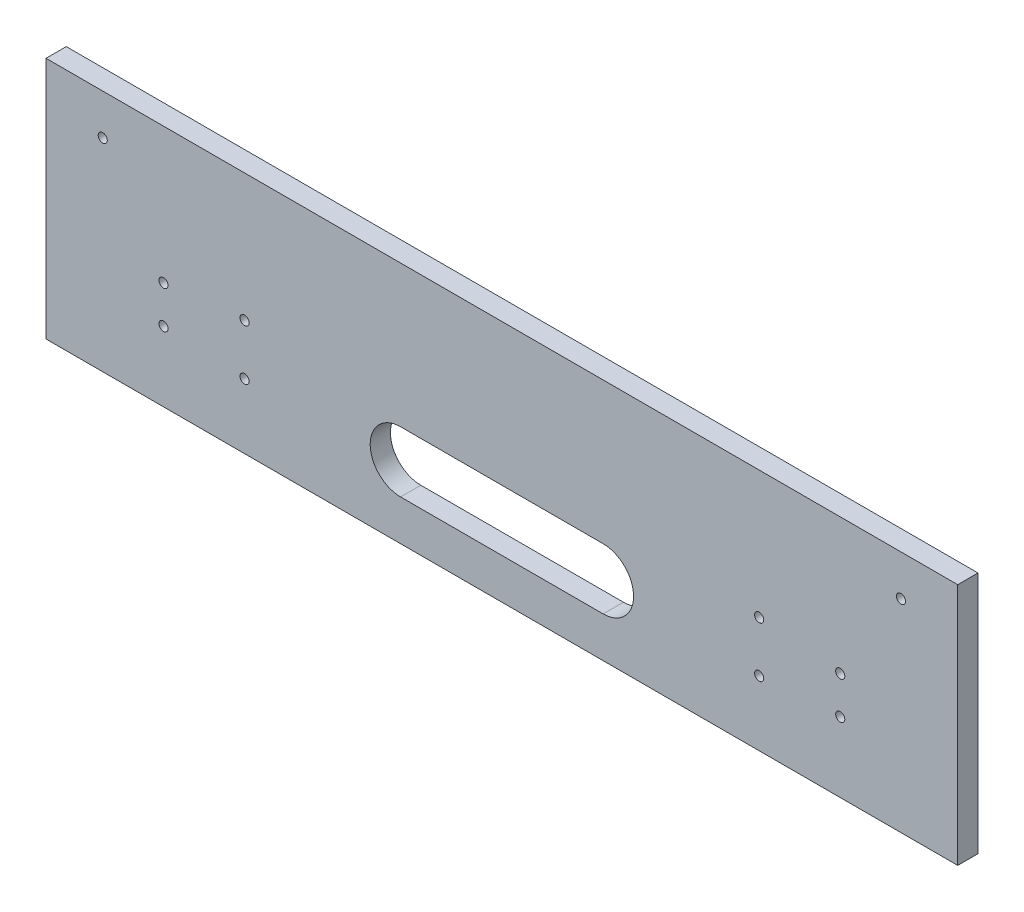
ISO-10303-21;
HEADER;
FILE_DESCRIPTION(('STEP AP214'),'2;1');
FILE_NAME('part.step','',(''),(''),'','','');
FILE_SCHEMA(('AUTOMOTIVE_DESIGN { 1 0 10303 214 1 1 1 1 }'));
ENDSEC;
DATA;
#1=APPLICATION_CONTEXT('core data for automotive mechanical design processes');
#2=APPLICATION_PROTOCOL_DEFINITION('international standard','automotive_design',2000,#1);
#3=PRODUCT_CONTEXT('',#1,'mechanical');
#4=PRODUCT('Part','Part','',(#3));
#5=PRODUCT_RELATED_PRODUCT_CATEGORY('part','',(#4));
#6=PRODUCT_DEFINITION_FORMATION('','',#4);
#7=PRODUCT_DEFINITION_CONTEXT('part definition',#1,'design');
#8=PRODUCT_DEFINITION('design','',#6,#7);
#9=PRODUCT_DEFINITION_SHAPE('','',#8);
#10=(LENGTH_UNIT() NAMED_UNIT(*) SI_UNIT(.MILLI.,.METRE.));
#11=(NAMED_UNIT(*) PLANE_ANGLE_UNIT() SI_UNIT($,.RADIAN.));
#12=(NAMED_UNIT(*) SI_UNIT($,.STERADIAN.) SOLID_ANGLE_UNIT());
#13=UNCERTAINTY_MEASURE_WITH_UNIT(LENGTH_MEASURE(1.E-05),#10,'distance_accuracy_value','');
#14=(GEOMETRIC_REPRESENTATION_CONTEXT(3) GLOBAL_UNCERTAINTY_ASSIGNED_CONTEXT((#13)) GLOBAL_UNIT_ASSIGNED_CONTEXT((#10,
#11,#12)) REPRESENTATION_CONTEXT('',''));
#15=CARTESIAN_POINT('',(0.,0.,0.));
#16=DIRECTION('',(0.,0.,1.));
#17=DIRECTION('',(1.,0.,0.));
#18=AXIS2_PLACEMENT_3D('',#15,#16,#17);
#19=CARTESIAN_POINT('',(-225.,60.,10.));
#20=DIRECTION('',(1.,0.,0.));
#21=DIRECTION('',(0.,0.,-1.));
#22=AXIS2_PLACEMENT_3D('',#19,#20,#21);
#23=PLANE('',#22);
#24=DIRECTION('',(0.,-1.,0.));
#25=VECTOR('',#24,1.);
#26=CARTESIAN_POINT('',(-225.,60.,0.));
#27=LINE('',#26,#25);
#28=CARTESIAN_POINT('',(-225.,60.,0.));
#29=VERTEX_POINT('',#28);
#30=CARTESIAN_POINT('',(-225.,-60.,0.));
#31=VERTEX_POINT('',#30);
#32=EDGE_CURVE('E138',#29,#31,#27,.T.);
#33=ORIENTED_EDGE('',*,*,#32,.T.);
#34=DIRECTION('',(0.,0.,-1.));
#35=VECTOR('',#34,1.);
#36=CARTESIAN_POINT('',(-225.,-60.,10.));
#37=LINE('',#36,#35);
#38=CARTESIAN_POINT('',(-225.,-60.,10.));
#39=VERTEX_POINT('',#38);
#40=EDGE_CURVE('E11',#39,#31,#37,.T.);
#41=ORIENTED_EDGE('',*,*,#40,.F.);
#42=DIRECTION('',(0.,-1.,0.));
#43=VECTOR('',#42,1.);
#44=CARTESIAN_POINT('',(-225.,60.,10.));
#45=LINE('',#44,#43);
#46=CARTESIAN_POINT('',(-225.,60.,10.));
#47=VERTEX_POINT('',#46);
#48=EDGE_CURVE('E142',#47,#39,#45,.T.);
#49=ORIENTED_EDGE('',*,*,#48,.F.);
#50=DIRECTION('',(0.,0.,-1.));
#51=VECTOR('',#50,1.);
#52=CARTESIAN_POINT('',(-225.,60.,10.));
#53=LINE('',#52,#51);
#54=EDGE_CURVE('E152',#47,#29,#53,.T.);
#55=ORIENTED_EDGE('',*,*,#54,.T.);
#56=EDGE_LOOP('',(#33,#41,#49,#55));
#57=FACE_BOUND('',#56,.T.);
#58=ADVANCED_FACE('F37',(#57),#23,.F.);
#59=CARTESIAN_POINT('',(-225.,-60.,10.));
#60=DIRECTION('',(0.,1.,0.));
#61=DIRECTION('',(0.,0.,1.));
#62=AXIS2_PLACEMENT_3D('',#59,#60,#61);
#63=PLANE('',#62);
#64=DIRECTION('',(1.,0.,0.));
#65=VECTOR('',#64,1.);
#66=CARTESIAN_POINT('',(-225.,-60.,0.));
#67=LINE('',#66,#65);
#68=CARTESIAN_POINT('',(225.,-60.,0.));
#69=VERTEX_POINT('',#68);
#70=EDGE_CURVE('E155',#31,#69,#67,.T.);
#71=ORIENTED_EDGE('',*,*,#70,.T.);
#72=DIRECTION('',(0.,0.,-1.));
#73=VECTOR('',#72,1.);
#74=CARTESIAN_POINT('',(225.,-60.,10.));
#75=LINE('',#74,#73);
#76=CARTESIAN_POINT('',(225.,-60.,10.));
#77=VERTEX_POINT('',#76);
#78=EDGE_CURVE('E44',#77,#69,#75,.T.);
#79=ORIENTED_EDGE('',*,*,#78,.F.);
#80=DIRECTION('',(1.,0.,0.));
#81=VECTOR('',#80,1.);
#82=CARTESIAN_POINT('',(-225.,-60.,10.));
#83=LINE('',#82,#81);
#84=EDGE_CURVE('E145',#39,#77,#83,.T.);
#85=ORIENTED_EDGE('',*,*,#84,.F.);
#86=ORIENTED_EDGE('',*,*,#40,.T.);
#87=EDGE_LOOP('',(#71,#79,#85,#86));
#88=FACE_BOUND('',#87,.T.);
#89=ADVANCED_FACE('F183',(#88),#63,.F.);
#90=CARTESIAN_POINT('',(225.,60.,10.));
#91=DIRECTION('',(-1.,0.,0.));
#92=DIRECTION('',(0.,-1.,0.));
#93=AXIS2_PLACEMENT_3D('',#90,#91,#92);
#94=PLANE('',#93);
#95=DIRECTION('',(0.,1.,0.));
#96=VECTOR('',#95,1.);
#97=CARTESIAN_POINT('',(225.,60.,0.));
#98=LINE('',#97,#96);
#99=CARTESIAN_POINT('',(225.,60.,0.));
#100=VERTEX_POINT('',#99);
#101=EDGE_CURVE('E157',#69,#100,#98,.T.);
#102=ORIENTED_EDGE('',*,*,#101,.T.);
#103=DIRECTION('',(0.,0.,-1.));
#104=VECTOR('',#103,1.);
#105=CARTESIAN_POINT('',(225.,60.,10.));
#106=LINE('',#105,#104);
#107=CARTESIAN_POINT('',(225.,60.,10.));
#108=VERTEX_POINT('',#107);
#109=EDGE_CURVE('E162',#108,#100,#106,.T.);
#110=ORIENTED_EDGE('',*,*,#109,.F.);
#111=DIRECTION('',(0.,1.,0.));
#112=VECTOR('',#111,1.);
#113=CARTESIAN_POINT('',(225.,60.,10.));
#114=LINE('',#113,#112);
#115=EDGE_CURVE('E148',#77,#108,#114,.T.);
#116=ORIENTED_EDGE('',*,*,#115,.F.);
#117=ORIENTED_EDGE('',*,*,#78,.T.);
#118=EDGE_LOOP('',(#102,#110,#116,#117));
#119=FACE_BOUND('',#118,.T.);
#120=ADVANCED_FACE('F169',(#119),#94,.F.);
#121=CARTESIAN_POINT('',(-225.,60.,10.));
#122=DIRECTION('',(0.,-1.,0.));
#123=DIRECTION('',(0.,0.,-1.));
#124=AXIS2_PLACEMENT_3D('',#121,#122,#123);
#125=PLANE('',#124);
#126=DIRECTION('',(-1.,0.,0.));
#127=VECTOR('',#126,1.);
#128=CARTESIAN_POINT('',(-225.,60.,0.));
#129=LINE('',#128,#127);
#130=EDGE_CURVE('E146',#100,#29,#129,.T.);
#131=ORIENTED_EDGE('',*,*,#130,.T.);
#132=ORIENTED_EDGE('',*,*,#54,.F.);
#133=DIRECTION('',(-1.,0.,0.));
#134=VECTOR('',#133,1.);
#135=CARTESIAN_POINT('',(-225.,60.,10.));
#136=LINE('',#135,#134);
#137=EDGE_CURVE('E150',#108,#47,#136,.T.);
#138=ORIENTED_EDGE('',*,*,#137,.F.);
#139=ORIENTED_EDGE('',*,*,#109,.T.);
#140=EDGE_LOOP('',(#131,#132,#138,#139));
#141=FACE_BOUND('',#140,.T.);
#142=ADVANCED_FACE('F176',(#141),#125,.F.);
#143=CARTESIAN_POINT('',(0.,0.,10.));
#144=DIRECTION('',(0.,0.,1.));
#145=DIRECTION('',(1.,0.,0.));
#146=AXIS2_PLACEMENT_3D('',#143,#144,#145);
#147=PLANE('',#146);
#148=CARTESIAN_POINT('',(127.,-3.,10.));
#149=DIRECTION('',(0.,0.,1.));
#150=DIRECTION('',(1.,0.,0.));
#151=AXIS2_PLACEMENT_3D('',#148,#149,#150);
#152=CIRCLE('',#151,2.25000000000001);
#153=CARTESIAN_POINT('',(129.25,-3.,10.));
#154=VERTEX_POINT('',#153);
#155=EDGE_CURVE('E272',#154,#154,#152,.T.);
#156=ORIENTED_EDGE('',*,*,#155,.F.);
#157=EDGE_LOOP('',(#156));
#158=FACE_BOUND('',#157,.T.);
#159=CARTESIAN_POINT('',(127.,-28.,10.));
#160=DIRECTION('',(0.,0.,1.));
#161=DIRECTION('',(1.,0.,0.));
#162=AXIS2_PLACEMENT_3D('',#159,#160,#161);
#163=CIRCLE('',#162,2.25000000000001);
#164=CARTESIAN_POINT('',(129.25,-28.,10.));
#165=VERTEX_POINT('',#164);
#166=EDGE_CURVE('E264',#165,#165,#163,.T.);
#167=ORIENTED_EDGE('',*,*,#166,.F.);
#168=EDGE_LOOP('',(#167));
#169=FACE_BOUND('',#168,.T.);
#170=CARTESIAN_POINT('',(-127.,-28.,10.));
#171=DIRECTION('',(0.,0.,1.));
#172=DIRECTION('',(1.,0.,0.));
#173=AXIS2_PLACEMENT_3D('',#170,#171,#172);
#174=CIRCLE('',#173,2.25000000000001);
#175=CARTESIAN_POINT('',(-124.75,-28.,10.));
#176=VERTEX_POINT('',#175);
#177=EDGE_CURVE('E257',#176,#176,#174,.T.);
#178=ORIENTED_EDGE('',*,*,#177,.F.);
#179=EDGE_LOOP('',(#178));
#180=FACE_BOUND('',#179,.T.);
#181=CARTESIAN_POINT('',(-127.,-3.,10.));
#182=DIRECTION('',(0.,0.,1.));
#183=DIRECTION('',(1.,0.,0.));
#184=AXIS2_PLACEMENT_3D('',#181,#182,#183);
#185=CIRCLE('',#184,2.25000000000001);
#186=CARTESIAN_POINT('',(-124.75,-3.,10.));
#187=VERTEX_POINT('',#186);
#188=EDGE_CURVE('E259',#187,#187,#185,.T.);
#189=ORIENTED_EDGE('',*,*,#188,.F.);
#190=EDGE_LOOP('',(#189));
#191=FACE_BOUND('',#190,.T.);
#192=CARTESIAN_POINT('',(197.,40.0000000000019,10.));
#193=DIRECTION('',(0.,0.,-1.));
#194=DIRECTION('',(-1.,0.,0.));
#195=AXIS2_PLACEMENT_3D('',#192,#193,#194);
#196=CIRCLE('',#195,2.25000000000001);
#197=CARTESIAN_POINT('',(194.75,40.0000000000019,10.));
#198=VERTEX_POINT('',#197);
#199=EDGE_CURVE('E279',#198,#198,#196,.T.);
#200=ORIENTED_EDGE('',*,*,#199,.T.);
#201=EDGE_LOOP('',(#200));
#202=FACE_BOUND('',#201,.T.);
#203=CARTESIAN_POINT('',(167.,-25.5000000000003,10.));
#204=DIRECTION('',(0.,0.,-1.));
#205=DIRECTION('',(-1.,0.,0.));
#206=AXIS2_PLACEMENT_3D('',#203,#204,#205);
#207=CIRCLE('',#206,2.25000000000001);
#208=CARTESIAN_POINT('',(164.75,-25.5000000000003,10.));
#209=VERTEX_POINT('',#208);
#210=EDGE_CURVE('E298',#209,#209,#207,.T.);
#211=ORIENTED_EDGE('',*,*,#210,.T.);
#212=EDGE_LOOP('',(#211));
#213=FACE_BOUND('',#212,.T.);
#214=CARTESIAN_POINT('',(-167.,-7.00000000000022,10.));
#215=DIRECTION('',(0.,0.,-1.));
#216=DIRECTION('',(-1.,0.,0.));
#217=AXIS2_PLACEMENT_3D('',#214,#215,#216);
#218=CIRCLE('',#217,2.25000000000001);
#219=CARTESIAN_POINT('',(-169.25,-7.00000000000022,10.));
#220=VERTEX_POINT('',#219);
#221=EDGE_CURVE('E284',#220,#220,#218,.T.);
#222=ORIENTED_EDGE('',*,*,#221,.T.);
#223=EDGE_LOOP('',(#222));
#224=FACE_BOUND('',#223,.T.);
#225=CARTESIAN_POINT('',(-167.,-25.5000000000002,10.));
#226=DIRECTION('',(0.,0.,-1.));
#227=DIRECTION('',(-1.,0.,0.));
#228=AXIS2_PLACEMENT_3D('',#225,#226,#227);
#229=CIRCLE('',#228,2.25000000000001);
#230=CARTESIAN_POINT('',(-169.25,-25.5000000000002,10.));
#231=VERTEX_POINT('',#230);
#232=EDGE_CURVE('E285',#231,#231,#229,.T.);
#233=ORIENTED_EDGE('',*,*,#232,.T.);
#234=EDGE_LOOP('',(#233));
#235=FACE_BOUND('',#234,.T.);
#236=CARTESIAN_POINT('',(-197.,40.0000000000023,10.));
#237=DIRECTION('',(0.,0.,-1.));
#238=DIRECTION('',(-1.,0.,0.));
#239=AXIS2_PLACEMENT_3D('',#236,#237,#238);
#240=CIRCLE('',#239,2.25000000000001);
#241=CARTESIAN_POINT('',(-199.25,40.0000000000023,10.));
#242=VERTEX_POINT('',#241);
#243=EDGE_CURVE('E291',#242,#242,#240,.T.);
#244=ORIENTED_EDGE('',*,*,#243,.T.);
#245=EDGE_LOOP('',(#244));
#246=FACE_BOUND('',#245,.T.);
#247=CARTESIAN_POINT('',(167.,-7.00000000000025,10.));
#248=DIRECTION('',(0.,0.,-1.));
#249=DIRECTION('',(-1.,0.,0.));
#250=AXIS2_PLACEMENT_3D('',#247,#248,#249);
#251=CIRCLE('',#250,2.25000000000001);
#252=CARTESIAN_POINT('',(164.75,-7.00000000000025,10.));
#253=VERTEX_POINT('',#252);
#254=EDGE_CURVE('E132',#253,#253,#251,.T.);
#255=ORIENTED_EDGE('',*,*,#254,.T.);
#256=EDGE_LOOP('',(#255));
#257=FACE_BOUND('',#256,.T.);
#258=CARTESIAN_POINT('',(-50.,-25.,10.));
#259=DIRECTION('',(0.,0.,1.));
#260=DIRECTION('',(1.,0.,0.));
#261=AXIS2_PLACEMENT_3D('',#258,#259,#260);
#262=CIRCLE('',#261,15.);
#263=CARTESIAN_POINT('',(-50.,-10.,10.));
#264=VERTEX_POINT('',#263);
#265=CARTESIAN_POINT('',(-50.,-40.,10.));
#266=VERTEX_POINT('',#265);
#267=EDGE_CURVE('E51',#264,#266,#262,.T.);
#268=ORIENTED_EDGE('',*,*,#267,.F.);
#269=DIRECTION('',(-1.,0.,0.));
#270=VECTOR('',#269,1.);
#271=CARTESIAN_POINT('',(-50.,-10.,10.));
#272=LINE('',#271,#270);
#273=CARTESIAN_POINT('',(50.,-9.99999999999999,10.));
#274=VERTEX_POINT('',#273);
#275=EDGE_CURVE('E119',#274,#264,#272,.T.);
#276=ORIENTED_EDGE('',*,*,#275,.F.);
#277=CARTESIAN_POINT('',(50.,-25.,10.));
#278=DIRECTION('',(0.,0.,1.));
#279=DIRECTION('',(1.,0.,0.));
#280=AXIS2_PLACEMENT_3D('',#277,#278,#279);
#281=CIRCLE('',#280,15.);
#282=CARTESIAN_POINT('',(50.,-40.,10.));
#283=VERTEX_POINT('',#282);
#284=EDGE_CURVE('E122',#283,#274,#281,.T.);
#285=ORIENTED_EDGE('',*,*,#284,.F.);
#286=DIRECTION('',(1.,0.,0.));
#287=VECTOR('',#286,1.);
#288=CARTESIAN_POINT('',(-50.,-40.,10.));
#289=LINE('',#288,#287);
#290=EDGE_CURVE('E131',#266,#283,#289,.T.);
#291=ORIENTED_EDGE('',*,*,#290,.F.);
#292=EDGE_LOOP('',(#268,#276,#285,#291));
#293=FACE_BOUND('',#292,.T.);
#294=ORIENTED_EDGE('',*,*,#48,.T.);
#295=ORIENTED_EDGE('',*,*,#84,.T.);
#296=ORIENTED_EDGE('',*,*,#115,.T.);
#297=ORIENTED_EDGE('',*,*,#137,.T.);
#298=EDGE_LOOP('',(#294,#295,#296,#297));
#299=FACE_BOUND('',#298,.T.);
#300=ADVANCED_FACE('F182',(#158,#169,#180,#191,#202,#213,#224,#235,#246,#257,#293,#299),#147,.T.);
#301=CARTESIAN_POINT('',(0.,0.,0.));
#302=DIRECTION('',(0.,0.,1.));
#303=DIRECTION('',(1.,0.,0.));
#304=AXIS2_PLACEMENT_3D('',#301,#302,#303);
#305=PLANE('',#304);
#306=CARTESIAN_POINT('',(127.,-3.,0.));
#307=DIRECTION('',(0.,0.,1.));
#308=DIRECTION('',(1.,0.,0.));
#309=AXIS2_PLACEMENT_3D('',#306,#307,#308);
#310=CIRCLE('',#309,2.25000000000001);
#311=CARTESIAN_POINT('',(129.25,-3.,0.));
#312=VERTEX_POINT('',#311);
#313=EDGE_CURVE('E275',#312,#312,#310,.T.);
#314=ORIENTED_EDGE('',*,*,#313,.T.);
#315=EDGE_LOOP('',(#314));
#316=FACE_BOUND('',#315,.T.);
#317=CARTESIAN_POINT('',(127.,-28.,0.));
#318=DIRECTION('',(0.,0.,1.));
#319=DIRECTION('',(1.,0.,0.));
#320=AXIS2_PLACEMENT_3D('',#317,#318,#319);
#321=CIRCLE('',#320,2.25000000000001);
#322=CARTESIAN_POINT('',(129.25,-28.,0.));
#323=VERTEX_POINT('',#322);
#324=EDGE_CURVE('E269',#323,#323,#321,.T.);
#325=ORIENTED_EDGE('',*,*,#324,.T.);
#326=EDGE_LOOP('',(#325));
#327=FACE_BOUND('',#326,.T.);
#328=CARTESIAN_POINT('',(-127.,-28.,0.));
#329=DIRECTION('',(0.,0.,1.));
#330=DIRECTION('',(1.,0.,0.));
#331=AXIS2_PLACEMENT_3D('',#328,#329,#330);
#332=CIRCLE('',#331,2.25000000000001);
#333=CARTESIAN_POINT('',(-124.75,-28.,0.));
#334=VERTEX_POINT('',#333);
#335=EDGE_CURVE('E254',#334,#334,#332,.T.);
#336=ORIENTED_EDGE('',*,*,#335,.T.);
#337=EDGE_LOOP('',(#336));
#338=FACE_BOUND('',#337,.T.);
#339=CARTESIAN_POINT('',(-127.,-3.,0.));
#340=DIRECTION('',(0.,0.,1.));
#341=DIRECTION('',(1.,0.,0.));
#342=AXIS2_PLACEMENT_3D('',#339,#340,#341);
#343=CIRCLE('',#342,2.25000000000001);
#344=CARTESIAN_POINT('',(-124.75,-3.,0.));
#345=VERTEX_POINT('',#344);
#346=EDGE_CURVE('E262',#345,#345,#343,.T.);
#347=ORIENTED_EDGE('',*,*,#346,.T.);
#348=EDGE_LOOP('',(#347));
#349=FACE_BOUND('',#348,.T.);
#350=CARTESIAN_POINT('',(197.,40.0000000000019,0.));
#351=DIRECTION('',(0.,0.,-1.));
#352=DIRECTION('',(-1.,0.,0.));
#353=AXIS2_PLACEMENT_3D('',#350,#351,#352);
#354=CIRCLE('',#353,2.25000000000001);
#355=CARTESIAN_POINT('',(194.75,40.0000000000019,0.));
#356=VERTEX_POINT('',#355);
#357=EDGE_CURVE('E294',#356,#356,#354,.T.);
#358=ORIENTED_EDGE('',*,*,#357,.F.);
#359=EDGE_LOOP('',(#358));
#360=FACE_BOUND('',#359,.T.);
#361=CARTESIAN_POINT('',(167.,-25.5000000000003,0.));
#362=DIRECTION('',(0.,0.,-1.));
#363=DIRECTION('',(-1.,0.,0.));
#364=AXIS2_PLACEMENT_3D('',#361,#362,#363);
#365=CIRCLE('',#364,2.25000000000001);
#366=CARTESIAN_POINT('',(164.75,-25.5000000000003,0.));
#367=VERTEX_POINT('',#366);
#368=EDGE_CURVE('E295',#367,#367,#365,.T.);
#369=ORIENTED_EDGE('',*,*,#368,.F.);
#370=EDGE_LOOP('',(#369));
#371=FACE_BOUND('',#370,.T.);
#372=CARTESIAN_POINT('',(-167.,-7.00000000000022,0.));
#373=DIRECTION('',(0.,0.,-1.));
#374=DIRECTION('',(-1.,0.,0.));
#375=AXIS2_PLACEMENT_3D('',#372,#373,#374);
#376=CIRCLE('',#375,2.25000000000001);
#377=CARTESIAN_POINT('',(-169.25,-7.00000000000022,0.));
#378=VERTEX_POINT('',#377);
#379=EDGE_CURVE('E301',#378,#378,#376,.T.);
#380=ORIENTED_EDGE('',*,*,#379,.F.);
#381=EDGE_LOOP('',(#380));
#382=FACE_BOUND('',#381,.T.);
#383=CARTESIAN_POINT('',(-167.,-25.5000000000002,0.));
#384=DIRECTION('',(0.,0.,-1.));
#385=DIRECTION('',(-1.,0.,0.));
#386=AXIS2_PLACEMENT_3D('',#383,#384,#385);
#387=CIRCLE('',#386,2.25000000000001);
#388=CARTESIAN_POINT('',(-169.25,-25.5000000000002,0.));
#389=VERTEX_POINT('',#388);
#390=EDGE_CURVE('E281',#389,#389,#387,.T.);
#391=ORIENTED_EDGE('',*,*,#390,.F.);
#392=EDGE_LOOP('',(#391));
#393=FACE_BOUND('',#392,.T.);
#394=CARTESIAN_POINT('',(-197.,40.0000000000023,0.));
#395=DIRECTION('',(0.,0.,-1.));
#396=DIRECTION('',(-1.,0.,0.));
#397=AXIS2_PLACEMENT_3D('',#394,#395,#396);
#398=CIRCLE('',#397,2.25000000000001);
#399=CARTESIAN_POINT('',(-199.25,40.0000000000023,0.));
#400=VERTEX_POINT('',#399);
#401=EDGE_CURVE('E288',#400,#400,#398,.T.);
#402=ORIENTED_EDGE('',*,*,#401,.F.);
#403=EDGE_LOOP('',(#402));
#404=FACE_BOUND('',#403,.T.);
#405=CARTESIAN_POINT('',(167.,-7.00000000000025,0.));
#406=DIRECTION('',(0.,0.,-1.));
#407=DIRECTION('',(-1.,0.,0.));
#408=AXIS2_PLACEMENT_3D('',#405,#406,#407);
#409=CIRCLE('',#408,2.25000000000001);
#410=CARTESIAN_POINT('',(164.75,-7.00000000000025,0.));
#411=VERTEX_POINT('',#410);
#412=EDGE_CURVE('E125',#411,#411,#409,.T.);
#413=ORIENTED_EDGE('',*,*,#412,.F.);
#414=EDGE_LOOP('',(#413));
#415=FACE_BOUND('',#414,.T.);
#416=DIRECTION('',(-1.,0.,0.));
#417=VECTOR('',#416,1.);
#418=CARTESIAN_POINT('',(-50.,-10.,0.));
#419=LINE('',#418,#417);
#420=CARTESIAN_POINT('',(50.,-9.99999999999999,0.));
#421=VERTEX_POINT('',#420);
#422=CARTESIAN_POINT('',(-50.,-10.,0.));
#423=VERTEX_POINT('',#422);
#424=EDGE_CURVE('E109',#421,#423,#419,.T.);
#425=ORIENTED_EDGE('',*,*,#424,.T.);
#426=CARTESIAN_POINT('',(-50.,-25.,0.));
#427=DIRECTION('',(0.,0.,1.));
#428=DIRECTION('',(1.,0.,0.));
#429=AXIS2_PLACEMENT_3D('',#426,#427,#428);
#430=CIRCLE('',#429,15.);
#431=CARTESIAN_POINT('',(-50.,-40.,0.));
#432=VERTEX_POINT('',#431);
#433=EDGE_CURVE('E103',#423,#432,#430,.T.);
#434=ORIENTED_EDGE('',*,*,#433,.T.);
#435=DIRECTION('',(1.,0.,0.));
#436=VECTOR('',#435,1.);
#437=CARTESIAN_POINT('',(-50.,-40.,0.));
#438=LINE('',#437,#436);
#439=CARTESIAN_POINT('',(50.,-40.,0.));
#440=VERTEX_POINT('',#439);
#441=EDGE_CURVE('E112',#432,#440,#438,.T.);
#442=ORIENTED_EDGE('',*,*,#441,.T.);
#443=CARTESIAN_POINT('',(50.,-25.,0.));
#444=DIRECTION('',(0.,0.,1.));
#445=DIRECTION('',(1.,0.,0.));
#446=AXIS2_PLACEMENT_3D('',#443,#444,#445);
#447=CIRCLE('',#446,15.);
#448=EDGE_CURVE('E59',#440,#421,#447,.T.);
#449=ORIENTED_EDGE('',*,*,#448,.T.);
#450=EDGE_LOOP('',(#425,#434,#442,#449));
#451=FACE_BOUND('',#450,.T.);
#452=ORIENTED_EDGE('',*,*,#32,.F.);
#453=ORIENTED_EDGE('',*,*,#130,.F.);
#454=ORIENTED_EDGE('',*,*,#101,.F.);
#455=ORIENTED_EDGE('',*,*,#70,.F.);
#456=EDGE_LOOP('',(#452,#453,#454,#455));
#457=FACE_BOUND('',#456,.T.);
#458=ADVANCED_FACE('F116',(#316,#327,#338,#349,#360,#371,#382,#393,#404,#415,#451,#457),#305,.F.);
#459=CARTESIAN_POINT('',(-50.,-25.,0.));
#460=DIRECTION('',(0.,0.,1.));
#461=DIRECTION('',(1.,0.,0.));
#462=AXIS2_PLACEMENT_3D('',#459,#460,#461);
#463=CYLINDRICAL_SURFACE('',#462,15.);
#464=ORIENTED_EDGE('',*,*,#267,.T.);
#465=DIRECTION('',(0.,0.,1.));
#466=VECTOR('',#465,1.);
#467=CARTESIAN_POINT('',(-50.,-40.,0.));
#468=LINE('',#467,#466);
#469=EDGE_CURVE('E99',#432,#266,#468,.T.);
#470=ORIENTED_EDGE('',*,*,#469,.F.);
#471=ORIENTED_EDGE('',*,*,#433,.F.);
#472=DIRECTION('',(0.,0.,1.));
#473=VECTOR('',#472,1.);
#474=CARTESIAN_POINT('',(-50.,-10.,0.));
#475=LINE('',#474,#473);
#476=EDGE_CURVE('E136',#423,#264,#475,.T.);
#477=ORIENTED_EDGE('',*,*,#476,.T.);
#478=EDGE_LOOP('',(#464,#470,#471,#477));
#479=FACE_BOUND('',#478,.T.);
#480=ADVANCED_FACE('F101',(#479),#463,.F.);
#481=CARTESIAN_POINT('',(-50.,-10.,0.));
#482=DIRECTION('',(0.,1.,0.));
#483=DIRECTION('',(-1.,0.,0.));
#484=AXIS2_PLACEMENT_3D('',#481,#482,#483);
#485=PLANE('',#484);
#486=ORIENTED_EDGE('',*,*,#275,.T.);
#487=ORIENTED_EDGE('',*,*,#476,.F.);
#488=ORIENTED_EDGE('',*,*,#424,.F.);
#489=DIRECTION('',(0.,0.,1.));
#490=VECTOR('',#489,1.);
#491=CARTESIAN_POINT('',(50.,-9.99999999999999,0.));
#492=LINE('',#491,#490);
#493=EDGE_CURVE('E139',#421,#274,#492,.T.);
#494=ORIENTED_EDGE('',*,*,#493,.T.);
#495=EDGE_LOOP('',(#486,#487,#488,#494));
#496=FACE_BOUND('',#495,.T.);
#497=ADVANCED_FACE('F201',(#496),#485,.F.);
#498=CARTESIAN_POINT('',(50.,-25.,0.));
#499=DIRECTION('',(0.,0.,1.));
#500=DIRECTION('',(1.,0.,0.));
#501=AXIS2_PLACEMENT_3D('',#498,#499,#500);
#502=CYLINDRICAL_SURFACE('',#501,15.);
#503=ORIENTED_EDGE('',*,*,#284,.T.);
#504=ORIENTED_EDGE('',*,*,#493,.F.);
#505=ORIENTED_EDGE('',*,*,#448,.F.);
#506=DIRECTION('',(0.,0.,1.));
#507=VECTOR('',#506,1.);
#508=CARTESIAN_POINT('',(50.,-40.,0.));
#509=LINE('',#508,#507);
#510=EDGE_CURVE('E108',#440,#283,#509,.T.);
#511=ORIENTED_EDGE('',*,*,#510,.T.);
#512=EDGE_LOOP('',(#503,#504,#505,#511));
#513=FACE_BOUND('',#512,.T.);
#514=ADVANCED_FACE('F205',(#513),#502,.F.);
#515=CARTESIAN_POINT('',(-50.,-40.,0.));
#516=DIRECTION('',(0.,-1.,0.));
#517=DIRECTION('',(1.,0.,0.));
#518=AXIS2_PLACEMENT_3D('',#515,#516,#517);
#519=PLANE('',#518);
#520=ORIENTED_EDGE('',*,*,#290,.T.);
#521=ORIENTED_EDGE('',*,*,#510,.F.);
#522=ORIENTED_EDGE('',*,*,#441,.F.);
#523=ORIENTED_EDGE('',*,*,#469,.T.);
#524=EDGE_LOOP('',(#520,#521,#522,#523));
#525=FACE_BOUND('',#524,.T.);
#526=ADVANCED_FACE('F113',(#525),#519,.F.);
#527=CARTESIAN_POINT('',(167.,-7.00000000000025,10.));
#528=DIRECTION('',(0.,0.,-1.));
#529=DIRECTION('',(-1.,0.,0.));
#530=AXIS2_PLACEMENT_3D('',#527,#528,#529);
#531=CYLINDRICAL_SURFACE('',#530,2.25000000000001);
#532=ORIENTED_EDGE('',*,*,#254,.F.);
#533=EDGE_LOOP('',(#532));
#534=FACE_BOUND('',#533,.T.);
#535=ORIENTED_EDGE('',*,*,#412,.T.);
#536=EDGE_LOOP('',(#535));
#537=FACE_BOUND('',#536,.T.);
#538=ADVANCED_FACE('F204',(#534,#537),#531,.F.);
#539=CARTESIAN_POINT('',(-197.,40.0000000000023,10.));
#540=DIRECTION('',(0.,0.,-1.));
#541=DIRECTION('',(-1.,0.,0.));
#542=AXIS2_PLACEMENT_3D('',#539,#540,#541);
#543=CYLINDRICAL_SURFACE('',#542,2.25000000000001);
#544=ORIENTED_EDGE('',*,*,#243,.F.);
#545=EDGE_LOOP('',(#544));
#546=FACE_BOUND('',#545,.T.);
#547=ORIENTED_EDGE('',*,*,#401,.T.);
#548=EDGE_LOOP('',(#547));
#549=FACE_BOUND('',#548,.T.);
#550=ADVANCED_FACE('F213',(#546,#549),#543,.F.);
#551=CARTESIAN_POINT('',(-167.,-25.5000000000002,10.));
#552=DIRECTION('',(0.,0.,-1.));
#553=DIRECTION('',(-1.,0.,0.));
#554=AXIS2_PLACEMENT_3D('',#551,#552,#553);
#555=CYLINDRICAL_SURFACE('',#554,2.25000000000001);
#556=ORIENTED_EDGE('',*,*,#232,.F.);
#557=EDGE_LOOP('',(#556));
#558=FACE_BOUND('',#557,.T.);
#559=ORIENTED_EDGE('',*,*,#390,.T.);
#560=EDGE_LOOP('',(#559));
#561=FACE_BOUND('',#560,.T.);
#562=ADVANCED_FACE('F224',(#558,#561),#555,.F.);
#563=CARTESIAN_POINT('',(-167.,-7.00000000000022,10.));
#564=DIRECTION('',(0.,0.,-1.));
#565=DIRECTION('',(-1.,0.,0.));
#566=AXIS2_PLACEMENT_3D('',#563,#564,#565);
#567=CYLINDRICAL_SURFACE('',#566,2.25000000000001);
#568=ORIENTED_EDGE('',*,*,#221,.F.);
#569=EDGE_LOOP('',(#568));
#570=FACE_BOUND('',#569,.T.);
#571=ORIENTED_EDGE('',*,*,#379,.T.);
#572=EDGE_LOOP('',(#571));
#573=FACE_BOUND('',#572,.T.);
#574=ADVANCED_FACE('F221',(#570,#573),#567,.F.);
#575=CARTESIAN_POINT('',(167.,-25.5000000000003,10.));
#576=DIRECTION('',(0.,0.,-1.));
#577=DIRECTION('',(-1.,0.,0.));
#578=AXIS2_PLACEMENT_3D('',#575,#576,#577);
#579=CYLINDRICAL_SURFACE('',#578,2.25000000000001);
#580=ORIENTED_EDGE('',*,*,#210,.F.);
#581=EDGE_LOOP('',(#580));
#582=FACE_BOUND('',#581,.T.);
#583=ORIENTED_EDGE('',*,*,#368,.T.);
#584=EDGE_LOOP('',(#583));
#585=FACE_BOUND('',#584,.T.);
#586=ADVANCED_FACE('F219',(#582,#585),#579,.F.);
#587=CARTESIAN_POINT('',(197.,40.0000000000019,10.));
#588=DIRECTION('',(0.,0.,-1.));
#589=DIRECTION('',(-1.,0.,0.));
#590=AXIS2_PLACEMENT_3D('',#587,#588,#589);
#591=CYLINDRICAL_SURFACE('',#590,2.25000000000001);
#592=ORIENTED_EDGE('',*,*,#199,.F.);
#593=EDGE_LOOP('',(#592));
#594=FACE_BOUND('',#593,.T.);
#595=ORIENTED_EDGE('',*,*,#357,.T.);
#596=EDGE_LOOP('',(#595));
#597=FACE_BOUND('',#596,.T.);
#598=ADVANCED_FACE('F215',(#594,#597),#591,.F.);
#599=CARTESIAN_POINT('',(-127.,-3.,0.));
#600=DIRECTION('',(0.,0.,1.));
#601=DIRECTION('',(1.,0.,0.));
#602=AXIS2_PLACEMENT_3D('',#599,#600,#601);
#603=CYLINDRICAL_SURFACE('',#602,2.25000000000001);
#604=ORIENTED_EDGE('',*,*,#346,.F.);
#605=EDGE_LOOP('',(#604));
#606=FACE_BOUND('',#605,.T.);
#607=ORIENTED_EDGE('',*,*,#188,.T.);
#608=EDGE_LOOP('',(#607));
#609=FACE_BOUND('',#608,.T.);
#610=ADVANCED_FACE('F218',(#606,#609),#603,.F.);
#611=CARTESIAN_POINT('',(-127.,-28.,0.));
#612=DIRECTION('',(0.,0.,1.));
#613=DIRECTION('',(1.,0.,0.));
#614=AXIS2_PLACEMENT_3D('',#611,#612,#613);
#615=CYLINDRICAL_SURFACE('',#614,2.25000000000001);
#616=ORIENTED_EDGE('',*,*,#335,.F.);
#617=EDGE_LOOP('',(#616));
#618=FACE_BOUND('',#617,.T.);
#619=ORIENTED_EDGE('',*,*,#177,.T.);
#620=EDGE_LOOP('',(#619));
#621=FACE_BOUND('',#620,.T.);
#622=ADVANCED_FACE('F237',(#618,#621),#615,.F.);
#623=CARTESIAN_POINT('',(127.,-28.,0.));
#624=DIRECTION('',(0.,0.,1.));
#625=DIRECTION('',(1.,0.,0.));
#626=AXIS2_PLACEMENT_3D('',#623,#624,#625);
#627=CYLINDRICAL_SURFACE('',#626,2.25000000000001);
#628=ORIENTED_EDGE('',*,*,#324,.F.);
#629=EDGE_LOOP('',(#628));
#630=FACE_BOUND('',#629,.T.);
#631=ORIENTED_EDGE('',*,*,#166,.T.);
#632=EDGE_LOOP('',(#631));
#633=FACE_BOUND('',#632,.T.);
#634=ADVANCED_FACE('F242',(#630,#633),#627,.F.);
#635=CARTESIAN_POINT('',(127.,-3.,0.));
#636=DIRECTION('',(0.,0.,1.));
#637=DIRECTION('',(1.,0.,0.));
#638=AXIS2_PLACEMENT_3D('',#635,#636,#637);
#639=CYLINDRICAL_SURFACE('',#638,2.25000000000001);
#640=ORIENTED_EDGE('',*,*,#313,.F.);
#641=EDGE_LOOP('',(#640));
#642=FACE_BOUND('',#641,.T.);
#643=ORIENTED_EDGE('',*,*,#155,.T.);
#644=EDGE_LOOP('',(#643));
#645=FACE_BOUND('',#644,.T.);
#646=ADVANCED_FACE('F239',(#642,#645),#639,.F.);
#647=CLOSED_SHELL('',(#58,#89,#120,#142,#300,#458,#480,#497,#514,#526,#538,#550,#562,#574,#586,
#598,#610,#622,#634,#646));
#648=MANIFOLD_SOLID_BREP('B2',#647);
#649=ADVANCED_BREP_SHAPE_REPRESENTATION('',(#18,#648),#14);
#650=SHAPE_DEFINITION_REPRESENTATION(#9,#649);
ENDSEC;
END-ISO-10303-21;
